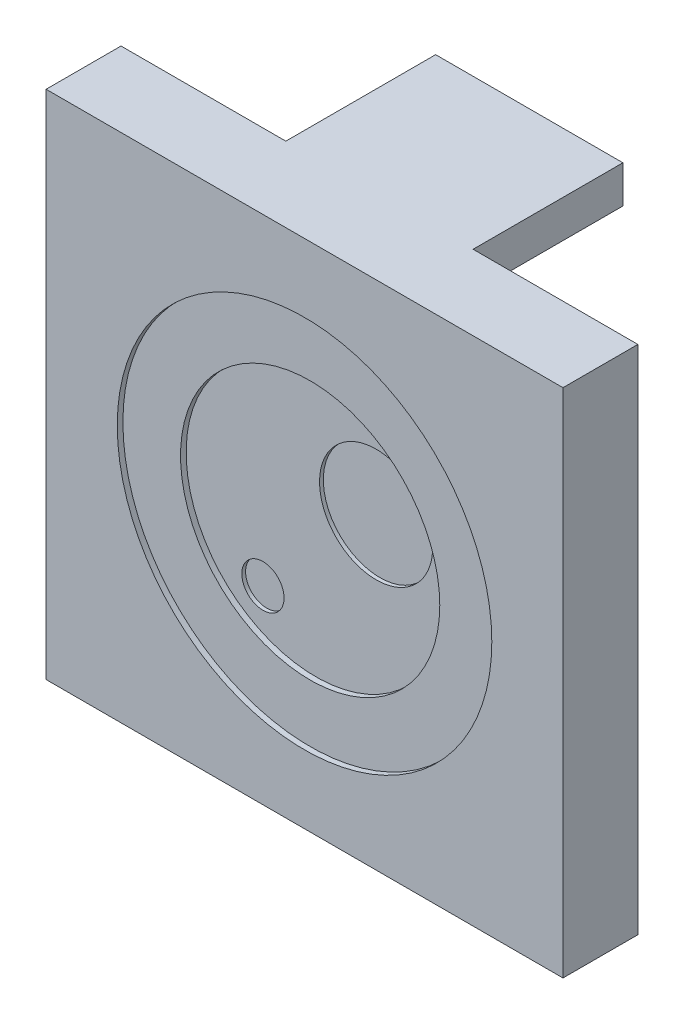
ISO-10303-21;
HEADER;
FILE_DESCRIPTION(('STEP AP214'),'2;1');
FILE_NAME('part.step','',(''),(''),'','','');
FILE_SCHEMA(('AUTOMOTIVE_DESIGN { 1 0 10303 214 1 1 1 1 }'));
ENDSEC;
DATA;
#1=APPLICATION_CONTEXT('core data for automotive mechanical design processes');
#2=APPLICATION_PROTOCOL_DEFINITION('international standard','automotive_design',2000,#1);
#3=PRODUCT_CONTEXT('',#1,'mechanical');
#4=PRODUCT('Part','Part','',(#3));
#5=PRODUCT_RELATED_PRODUCT_CATEGORY('part','',(#4));
#6=PRODUCT_DEFINITION_FORMATION('','',#4);
#7=PRODUCT_DEFINITION_CONTEXT('part definition',#1,'design');
#8=PRODUCT_DEFINITION('design','',#6,#7);
#9=PRODUCT_DEFINITION_SHAPE('','',#8);
#10=(LENGTH_UNIT() NAMED_UNIT(*) SI_UNIT(.MILLI.,.METRE.));
#11=(NAMED_UNIT(*) PLANE_ANGLE_UNIT() SI_UNIT($,.RADIAN.));
#12=(NAMED_UNIT(*) SI_UNIT($,.STERADIAN.) SOLID_ANGLE_UNIT());
#13=UNCERTAINTY_MEASURE_WITH_UNIT(LENGTH_MEASURE(1.E-05),#10,'distance_accuracy_value','');
#14=(GEOMETRIC_REPRESENTATION_CONTEXT(3) GLOBAL_UNCERTAINTY_ASSIGNED_CONTEXT((#13)) GLOBAL_UNIT_ASSIGNED_CONTEXT((#10,
#11,#12)) REPRESENTATION_CONTEXT('',''));
#15=CARTESIAN_POINT('',(0.,0.,0.));
#16=DIRECTION('',(0.,0.,1.));
#17=DIRECTION('',(1.,0.,0.));
#18=AXIS2_PLACEMENT_3D('',#15,#16,#17);
#19=CARTESIAN_POINT('',(13.8,-13.65,4.));
#20=DIRECTION('',(-1.,0.,0.));
#21=DIRECTION('',(0.,0.,1.));
#22=AXIS2_PLACEMENT_3D('',#19,#20,#21);
#23=PLANE('',#22);
#24=DIRECTION('',(0.,1.,0.));
#25=VECTOR('',#24,1.);
#26=CARTESIAN_POINT('',(13.8,-13.65,0.));
#27=LINE('',#26,#25);
#28=CARTESIAN_POINT('',(13.8,-13.65,0.));
#29=VERTEX_POINT('',#28);
#30=CARTESIAN_POINT('',(13.8,13.65,0.));
#31=VERTEX_POINT('',#30);
#32=EDGE_CURVE('E146',#29,#31,#27,.T.);
#33=ORIENTED_EDGE('',*,*,#32,.T.);
#34=DIRECTION('',(0.,0.,-1.));
#35=VECTOR('',#34,1.);
#36=CARTESIAN_POINT('',(13.8,13.65,4.));
#37=LINE('',#36,#35);
#38=CARTESIAN_POINT('',(13.8,13.65,4.));
#39=VERTEX_POINT('',#38);
#40=EDGE_CURVE('E11',#39,#31,#37,.T.);
#41=ORIENTED_EDGE('',*,*,#40,.F.);
#42=DIRECTION('',(0.,1.,0.));
#43=VECTOR('',#42,1.);
#44=CARTESIAN_POINT('',(13.8,-13.65,4.));
#45=LINE('',#44,#43);
#46=CARTESIAN_POINT('',(13.8,-13.65,4.));
#47=VERTEX_POINT('',#46);
#48=EDGE_CURVE('E150',#47,#39,#45,.T.);
#49=ORIENTED_EDGE('',*,*,#48,.F.);
#50=DIRECTION('',(0.,0.,-1.));
#51=VECTOR('',#50,1.);
#52=CARTESIAN_POINT('',(13.8,-13.65,4.));
#53=LINE('',#52,#51);
#54=EDGE_CURVE('E160',#47,#29,#53,.T.);
#55=ORIENTED_EDGE('',*,*,#54,.T.);
#56=EDGE_LOOP('',(#33,#41,#49,#55));
#57=FACE_BOUND('',#56,.T.);
#58=ADVANCED_FACE('F37',(#57),#23,.F.);
#59=CARTESIAN_POINT('',(-13.8,13.65,4.));
#60=DIRECTION('',(0.,-1.,0.));
#61=DIRECTION('',(0.,0.,-1.));
#62=AXIS2_PLACEMENT_3D('',#59,#60,#61);
#63=PLANE('',#62);
#64=DIRECTION('',(-1.,0.,0.));
#65=VECTOR('',#64,1.);
#66=CARTESIAN_POINT('',(-13.8,13.65,0.));
#67=LINE('',#66,#65);
#68=CARTESIAN_POINT('',(4.99999999999999,13.65,0.));
#69=VERTEX_POINT('',#68);
#70=EDGE_CURVE('E163',#31,#69,#67,.T.);
#71=ORIENTED_EDGE('',*,*,#70,.T.);
#72=DIRECTION('',(0.,0.,1.));
#73=VECTOR('',#72,1.);
#74=CARTESIAN_POINT('',(5.,13.65,-8.));
#75=LINE('',#74,#73);
#76=CARTESIAN_POINT('',(5.,13.65,-8.));
#77=VERTEX_POINT('',#76);
#78=EDGE_CURVE('E111',#77,#69,#75,.T.);
#79=ORIENTED_EDGE('',*,*,#78,.F.);
#80=DIRECTION('',(1.,0.,0.));
#81=VECTOR('',#80,1.);
#82=CARTESIAN_POINT('',(5.,13.65,-8.));
#83=LINE('',#82,#81);
#84=CARTESIAN_POINT('',(-5.,13.65,-8.));
#85=VERTEX_POINT('',#84);
#86=EDGE_CURVE('E104',#85,#77,#83,.T.);
#87=ORIENTED_EDGE('',*,*,#86,.F.);
#88=DIRECTION('',(0.,0.,1.));
#89=VECTOR('',#88,1.);
#90=CARTESIAN_POINT('',(-5.,13.65,-8.));
#91=LINE('',#90,#89);
#92=CARTESIAN_POINT('',(-5.00000000000001,13.65,0.));
#93=VERTEX_POINT('',#92);
#94=EDGE_CURVE('E109',#85,#93,#91,.T.);
#95=ORIENTED_EDGE('',*,*,#94,.T.);
#96=CARTESIAN_POINT('',(-13.8,13.65,0.));
#97=VERTEX_POINT('',#96);
#98=EDGE_CURVE('E58',#93,#97,#67,.T.);
#99=ORIENTED_EDGE('',*,*,#98,.T.);
#100=DIRECTION('',(0.,0.,-1.));
#101=VECTOR('',#100,1.);
#102=CARTESIAN_POINT('',(-13.8,13.65,4.));
#103=LINE('',#102,#101);
#104=CARTESIAN_POINT('',(-13.8,13.65,4.));
#105=VERTEX_POINT('',#104);
#106=EDGE_CURVE('E45',#105,#97,#103,.T.);
#107=ORIENTED_EDGE('',*,*,#106,.F.);
#108=DIRECTION('',(-1.,0.,0.));
#109=VECTOR('',#108,1.);
#110=CARTESIAN_POINT('',(-13.8,13.65,4.));
#111=LINE('',#110,#109);
#112=EDGE_CURVE('E153',#39,#105,#111,.T.);
#113=ORIENTED_EDGE('',*,*,#112,.F.);
#114=ORIENTED_EDGE('',*,*,#40,.T.);
#115=EDGE_LOOP('',(#71,#79,#87,#95,#99,#107,#113,#114));
#116=FACE_BOUND('',#115,.T.);
#117=ADVANCED_FACE('F107',(#116),#63,.F.);
#118=CARTESIAN_POINT('',(-13.8,-13.65,4.));
#119=DIRECTION('',(1.,0.,0.));
#120=DIRECTION('',(0.,0.,-1.));
#121=AXIS2_PLACEMENT_3D('',#118,#119,#120);
#122=PLANE('',#121);
#123=DIRECTION('',(0.,-1.,0.));
#124=VECTOR('',#123,1.);
#125=CARTESIAN_POINT('',(-13.8,-13.65,0.));
#126=LINE('',#125,#124);
#127=CARTESIAN_POINT('',(-13.8,-13.65,0.));
#128=VERTEX_POINT('',#127);
#129=EDGE_CURVE('E165',#97,#128,#126,.T.);
#130=ORIENTED_EDGE('',*,*,#129,.T.);
#131=DIRECTION('',(0.,0.,-1.));
#132=VECTOR('',#131,1.);
#133=CARTESIAN_POINT('',(-13.8,-13.65,4.));
#134=LINE('',#133,#132);
#135=CARTESIAN_POINT('',(-13.8,-13.65,4.));
#136=VERTEX_POINT('',#135);
#137=EDGE_CURVE('E170',#136,#128,#134,.T.);
#138=ORIENTED_EDGE('',*,*,#137,.F.);
#139=DIRECTION('',(0.,-1.,0.));
#140=VECTOR('',#139,1.);
#141=CARTESIAN_POINT('',(-13.8,-13.65,4.));
#142=LINE('',#141,#140);
#143=EDGE_CURVE('E156',#105,#136,#142,.T.);
#144=ORIENTED_EDGE('',*,*,#143,.F.);
#145=ORIENTED_EDGE('',*,*,#106,.T.);
#146=EDGE_LOOP('',(#130,#138,#144,#145));
#147=FACE_BOUND('',#146,.T.);
#148=ADVANCED_FACE('F208',(#147),#122,.F.);
#149=CARTESIAN_POINT('',(-13.8,-13.65,4.));
#150=DIRECTION('',(0.,1.,0.));
#151=DIRECTION('',(0.,0.,1.));
#152=AXIS2_PLACEMENT_3D('',#149,#150,#151);
#153=PLANE('',#152);
#154=DIRECTION('',(1.,0.,0.));
#155=VECTOR('',#154,1.);
#156=CARTESIAN_POINT('',(-13.8,-13.65,0.));
#157=LINE('',#156,#155);
#158=EDGE_CURVE('E154',#128,#29,#157,.T.);
#159=ORIENTED_EDGE('',*,*,#158,.T.);
#160=ORIENTED_EDGE('',*,*,#54,.F.);
#161=DIRECTION('',(1.,0.,0.));
#162=VECTOR('',#161,1.);
#163=CARTESIAN_POINT('',(-13.8,-13.65,4.));
#164=LINE('',#163,#162);
#165=EDGE_CURVE('E158',#136,#47,#164,.T.);
#166=ORIENTED_EDGE('',*,*,#165,.F.);
#167=ORIENTED_EDGE('',*,*,#137,.T.);
#168=EDGE_LOOP('',(#159,#160,#166,#167));
#169=FACE_BOUND('',#168,.T.);
#170=ADVANCED_FACE('F224',(#169),#153,.F.);
#171=CARTESIAN_POINT('',(0.,0.,4.));
#172=DIRECTION('',(0.,0.,-1.));
#173=DIRECTION('',(-1.,0.,0.));
#174=AXIS2_PLACEMENT_3D('',#171,#172,#173);
#175=PLANE('',#174);
#176=CARTESIAN_POINT('',(0.,0.,4.));
#177=DIRECTION('',(0.,0.,1.));
#178=DIRECTION('',(1.,0.,0.));
#179=AXIS2_PLACEMENT_3D('',#176,#177,#178);
#180=CIRCLE('',#179,10.);
#181=CARTESIAN_POINT('',(10.,0.,4.));
#182=VERTEX_POINT('',#181);
#183=EDGE_CURVE('E147',#182,#182,#180,.T.);
#184=ORIENTED_EDGE('',*,*,#183,.F.);
#185=EDGE_LOOP('',(#184));
#186=FACE_BOUND('',#185,.T.);
#187=ORIENTED_EDGE('',*,*,#48,.T.);
#188=ORIENTED_EDGE('',*,*,#112,.T.);
#189=ORIENTED_EDGE('',*,*,#143,.T.);
#190=ORIENTED_EDGE('',*,*,#165,.T.);
#191=EDGE_LOOP('',(#187,#188,#189,#190));
#192=FACE_BOUND('',#191,.T.);
#193=ADVANCED_FACE('F220',(#186,#192),#175,.F.);
#194=CARTESIAN_POINT('',(0.,0.,0.));
#195=DIRECTION('',(0.,0.,-1.));
#196=DIRECTION('',(-1.,0.,0.));
#197=AXIS2_PLACEMENT_3D('',#194,#195,#196);
#198=PLANE('',#197);
#199=DIRECTION('',(0.,1.,0.));
#200=VECTOR('',#199,1.);
#201=CARTESIAN_POINT('',(-5.,13.65,0.));
#202=LINE('',#201,#200);
#203=CARTESIAN_POINT('',(-5.,11.65,0.));
#204=VERTEX_POINT('',#203);
#205=EDGE_CURVE('E53',#204,#93,#202,.T.);
#206=ORIENTED_EDGE('',*,*,#205,.F.);
#207=DIRECTION('',(-1.,0.,0.));
#208=VECTOR('',#207,1.);
#209=CARTESIAN_POINT('',(5.,11.65,0.));
#210=LINE('',#209,#208);
#211=CARTESIAN_POINT('',(5.,11.65,0.));
#212=VERTEX_POINT('',#211);
#213=EDGE_CURVE('E124',#212,#204,#210,.T.);
#214=ORIENTED_EDGE('',*,*,#213,.F.);
#215=DIRECTION('',(0.,-1.,0.));
#216=VECTOR('',#215,1.);
#217=CARTESIAN_POINT('',(5.,13.65,0.));
#218=LINE('',#217,#216);
#219=EDGE_CURVE('E216',#69,#212,#218,.T.);
#220=ORIENTED_EDGE('',*,*,#219,.F.);
#221=ORIENTED_EDGE('',*,*,#70,.F.);
#222=ORIENTED_EDGE('',*,*,#32,.F.);
#223=ORIENTED_EDGE('',*,*,#158,.F.);
#224=ORIENTED_EDGE('',*,*,#129,.F.);
#225=ORIENTED_EDGE('',*,*,#98,.F.);
#226=EDGE_LOOP('',(#206,#214,#220,#221,#222,#223,#224,#225));
#227=FACE_BOUND('',#226,.T.);
#228=ADVANCED_FACE('F214',(#227),#198,.T.);
#229=CARTESIAN_POINT('',(0.,0.,3.7));
#230=DIRECTION('',(0.,0.,1.));
#231=DIRECTION('',(1.,0.,0.));
#232=AXIS2_PLACEMENT_3D('',#229,#230,#231);
#233=CYLINDRICAL_SURFACE('',#232,10.);
#234=CARTESIAN_POINT('',(0.,0.,3.7));
#235=DIRECTION('',(0.,0.,1.));
#236=DIRECTION('',(1.,0.,0.));
#237=AXIS2_PLACEMENT_3D('',#234,#235,#236);
#238=CIRCLE('',#237,10.);
#239=CARTESIAN_POINT('',(10.,0.,3.7));
#240=VERTEX_POINT('',#239);
#241=EDGE_CURVE('E143',#240,#240,#238,.T.);
#242=ORIENTED_EDGE('',*,*,#241,.F.);
#243=EDGE_LOOP('',(#242));
#244=FACE_BOUND('',#243,.T.);
#245=ORIENTED_EDGE('',*,*,#183,.T.);
#246=EDGE_LOOP('',(#245));
#247=FACE_BOUND('',#246,.T.);
#248=ADVANCED_FACE('F199',(#244,#247),#233,.F.);
#249=CARTESIAN_POINT('',(0.,0.,3.7));
#250=DIRECTION('',(0.,0.,1.));
#251=DIRECTION('',(1.,0.,0.));
#252=AXIS2_PLACEMENT_3D('',#249,#250,#251);
#253=PLANE('',#252);
#254=CARTESIAN_POINT('',(0.,0.,3.7));
#255=DIRECTION('',(0.,0.,1.));
#256=DIRECTION('',(1.,0.,0.));
#257=AXIS2_PLACEMENT_3D('',#254,#255,#256);
#258=CIRCLE('',#257,6.92166100032446);
#259=CARTESIAN_POINT('',(6.92166100032446,0.,3.7));
#260=VERTEX_POINT('',#259);
#261=EDGE_CURVE('E142',#260,#260,#258,.T.);
#262=ORIENTED_EDGE('',*,*,#261,.F.);
#263=EDGE_LOOP('',(#262));
#264=FACE_BOUND('',#263,.T.);
#265=ORIENTED_EDGE('',*,*,#241,.T.);
#266=EDGE_LOOP('',(#265));
#267=FACE_BOUND('',#266,.T.);
#268=ADVANCED_FACE('F189',(#264,#267),#253,.T.);
#269=CARTESIAN_POINT('',(0.,0.,3.4));
#270=DIRECTION('',(0.,0.,1.));
#271=DIRECTION('',(1.,0.,0.));
#272=AXIS2_PLACEMENT_3D('',#269,#270,#271);
#273=CYLINDRICAL_SURFACE('',#272,6.92166100032446);
#274=ORIENTED_EDGE('',*,*,#261,.T.);
#275=EDGE_LOOP('',(#274));
#276=FACE_BOUND('',#275,.T.);
#277=CARTESIAN_POINT('',(0.,0.,3.4));
#278=DIRECTION('',(0.,0.,1.));
#279=DIRECTION('',(1.,0.,0.));
#280=AXIS2_PLACEMENT_3D('',#277,#278,#279);
#281=CIRCLE('',#280,6.92166100032446);
#282=CARTESIAN_POINT('',(5.71853676061223,3.89970874821944,3.4));
#283=VERTEX_POINT('',#282);
#284=EDGE_CURVE('E139',#283,#283,#281,.T.);
#285=ORIENTED_EDGE('',*,*,#284,.F.);
#286=EDGE_LOOP('',(#285));
#287=FACE_BOUND('',#286,.T.);
#288=ADVANCED_FACE('F187',(#276,#287),#273,.F.);
#289=CARTESIAN_POINT('',(0.,0.,3.4));
#290=DIRECTION('',(0.,0.,1.));
#291=DIRECTION('',(1.,0.,0.));
#292=AXIS2_PLACEMENT_3D('',#289,#290,#291);
#293=PLANE('',#292);
#294=CARTESIAN_POINT('',(-2.82117522216301,-4.12807102238485,3.4));
#295=DIRECTION('',(0.,0.,1.));
#296=DIRECTION('',(1.,0.,0.));
#297=AXIS2_PLACEMENT_3D('',#294,#295,#296);
#298=CIRCLE('',#297,1.12734678840662);
#299=CARTESIAN_POINT('',(-1.69382843375639,-4.12807102238485,3.4));
#300=VERTEX_POINT('',#299);
#301=EDGE_CURVE('E137',#300,#300,#298,.T.);
#302=ORIENTED_EDGE('',*,*,#301,.F.);
#303=EDGE_LOOP('',(#302));
#304=FACE_BOUND('',#303,.T.);
#305=ORIENTED_EDGE('',*,*,#284,.T.);
#306=CARTESIAN_POINT('',(3.22301591790364,2.1979089926063,3.4));
#307=DIRECTION('',(0.,0.,1.));
#308=DIRECTION('',(1.,0.,0.));
#309=AXIS2_PLACEMENT_3D('',#306,#307,#308);
#310=CIRCLE('',#309,3.02055403603345);
#311=EDGE_CURVE('E40',#283,#283,#310,.T.);
#312=ORIENTED_EDGE('',*,*,#311,.F.);
#313=EDGE_LOOP('',(#305,#312));
#314=FACE_BOUND('',#313,.T.);
#315=ADVANCED_FACE('F184',(#304,#314),#293,.T.);
#316=CARTESIAN_POINT('',(-2.82117522216301,-4.12807102238485,3.2));
#317=DIRECTION('',(0.,0.,1.));
#318=DIRECTION('',(1.,0.,0.));
#319=AXIS2_PLACEMENT_3D('',#316,#317,#318);
#320=CYLINDRICAL_SURFACE('',#319,1.12734678840662);
#321=ORIENTED_EDGE('',*,*,#301,.T.);
#322=EDGE_LOOP('',(#321));
#323=FACE_BOUND('',#322,.T.);
#324=CARTESIAN_POINT('',(-2.82117522216301,-4.12807102238485,3.2));
#325=DIRECTION('',(0.,0.,1.));
#326=DIRECTION('',(1.,0.,0.));
#327=AXIS2_PLACEMENT_3D('',#324,#325,#326);
#328=CIRCLE('',#327,1.12734678840662);
#329=CARTESIAN_POINT('',(-1.69382843375639,-4.12807102238485,3.2));
#330=VERTEX_POINT('',#329);
#331=EDGE_CURVE('E127',#330,#330,#328,.T.);
#332=ORIENTED_EDGE('',*,*,#331,.F.);
#333=EDGE_LOOP('',(#332));
#334=FACE_BOUND('',#333,.T.);
#335=ADVANCED_FACE('F196',(#323,#334),#320,.F.);
#336=CARTESIAN_POINT('',(-2.82117522216301,-4.12807102238485,3.2));
#337=DIRECTION('',(0.,0.,1.));
#338=DIRECTION('',(1.,0.,0.));
#339=AXIS2_PLACEMENT_3D('',#336,#337,#338);
#340=PLANE('',#339);
#341=ORIENTED_EDGE('',*,*,#331,.T.);
#342=EDGE_LOOP('',(#341));
#343=FACE_BOUND('',#342,.T.);
#344=ADVANCED_FACE('F275',(#343),#340,.T.);
#345=CARTESIAN_POINT('',(3.22301591790364,2.1979089926063,3.2));
#346=DIRECTION('',(0.,0.,1.));
#347=DIRECTION('',(1.,0.,0.));
#348=AXIS2_PLACEMENT_3D('',#345,#346,#347);
#349=CYLINDRICAL_SURFACE('',#348,3.02055403603345);
#350=ORIENTED_EDGE('',*,*,#311,.T.);
#351=EDGE_LOOP('',(#350));
#352=FACE_BOUND('',#351,.T.);
#353=CARTESIAN_POINT('',(3.22301591790364,2.1979089926063,3.2));
#354=DIRECTION('',(0.,0.,1.));
#355=DIRECTION('',(1.,0.,0.));
#356=AXIS2_PLACEMENT_3D('',#353,#354,#355);
#357=CIRCLE('',#356,3.02055403603345);
#358=CARTESIAN_POINT('',(6.24356995393708,2.1979089926063,3.2));
#359=VERTEX_POINT('',#358);
#360=EDGE_CURVE('E130',#359,#359,#357,.T.);
#361=ORIENTED_EDGE('',*,*,#360,.F.);
#362=EDGE_LOOP('',(#361));
#363=FACE_BOUND('',#362,.T.);
#364=ADVANCED_FACE('F181',(#352,#363),#349,.F.);
#365=CARTESIAN_POINT('',(3.22301591790364,2.1979089926063,3.2));
#366=DIRECTION('',(0.,0.,1.));
#367=DIRECTION('',(1.,0.,0.));
#368=AXIS2_PLACEMENT_3D('',#365,#366,#367);
#369=PLANE('',#368);
#370=ORIENTED_EDGE('',*,*,#360,.T.);
#371=EDGE_LOOP('',(#370));
#372=FACE_BOUND('',#371,.T.);
#373=ADVANCED_FACE('F293',(#372),#369,.T.);
#374=CARTESIAN_POINT('',(-5.,13.65,-8.));
#375=DIRECTION('',(1.,0.,0.));
#376=DIRECTION('',(0.,0.,-1.));
#377=AXIS2_PLACEMENT_3D('',#374,#375,#376);
#378=PLANE('',#377);
#379=ORIENTED_EDGE('',*,*,#205,.T.);
#380=ORIENTED_EDGE('',*,*,#94,.F.);
#381=DIRECTION('',(0.,1.,0.));
#382=VECTOR('',#381,1.);
#383=CARTESIAN_POINT('',(-5.,13.65,-8.));
#384=LINE('',#383,#382);
#385=CARTESIAN_POINT('',(-5.,11.65,-8.));
#386=VERTEX_POINT('',#385);
#387=EDGE_CURVE('E115',#386,#85,#384,.T.);
#388=ORIENTED_EDGE('',*,*,#387,.F.);
#389=DIRECTION('',(0.,0.,1.));
#390=VECTOR('',#389,1.);
#391=CARTESIAN_POINT('',(-5.,11.65,-8.));
#392=LINE('',#391,#390);
#393=EDGE_CURVE('E351',#386,#204,#392,.T.);
#394=ORIENTED_EDGE('',*,*,#393,.T.);
#395=EDGE_LOOP('',(#379,#380,#388,#394));
#396=FACE_BOUND('',#395,.T.);
#397=ADVANCED_FACE('F126',(#396),#378,.F.);
#398=CARTESIAN_POINT('',(5.,13.65,-8.));
#399=DIRECTION('',(-1.,0.,0.));
#400=DIRECTION('',(0.,-1.,0.));
#401=AXIS2_PLACEMENT_3D('',#398,#399,#400);
#402=PLANE('',#401);
#403=ORIENTED_EDGE('',*,*,#219,.T.);
#404=DIRECTION('',(0.,0.,1.));
#405=VECTOR('',#404,1.);
#406=CARTESIAN_POINT('',(5.,11.65,-8.));
#407=LINE('',#406,#405);
#408=CARTESIAN_POINT('',(5.,11.65,-8.));
#409=VERTEX_POINT('',#408);
#410=EDGE_CURVE('E132',#409,#212,#407,.T.);
#411=ORIENTED_EDGE('',*,*,#410,.F.);
#412=DIRECTION('',(0.,-1.,0.));
#413=VECTOR('',#412,1.);
#414=CARTESIAN_POINT('',(5.,13.65,-8.));
#415=LINE('',#414,#413);
#416=EDGE_CURVE('E114',#77,#409,#415,.T.);
#417=ORIENTED_EDGE('',*,*,#416,.F.);
#418=ORIENTED_EDGE('',*,*,#78,.T.);
#419=EDGE_LOOP('',(#403,#411,#417,#418));
#420=FACE_BOUND('',#419,.T.);
#421=ADVANCED_FACE('F319',(#420),#402,.F.);
#422=CARTESIAN_POINT('',(5.,11.65,-8.));
#423=DIRECTION('',(0.,1.,0.));
#424=DIRECTION('',(0.,0.,1.));
#425=AXIS2_PLACEMENT_3D('',#422,#423,#424);
#426=PLANE('',#425);
#427=ORIENTED_EDGE('',*,*,#213,.T.);
#428=ORIENTED_EDGE('',*,*,#393,.F.);
#429=DIRECTION('',(-1.,0.,0.));
#430=VECTOR('',#429,1.);
#431=CARTESIAN_POINT('',(5.,11.65,-8.));
#432=LINE('',#431,#430);
#433=EDGE_CURVE('E120',#409,#386,#432,.T.);
#434=ORIENTED_EDGE('',*,*,#433,.F.);
#435=ORIENTED_EDGE('',*,*,#410,.T.);
#436=EDGE_LOOP('',(#427,#428,#434,#435));
#437=FACE_BOUND('',#436,.T.);
#438=ADVANCED_FACE('F328',(#437),#426,.F.);
#439=CARTESIAN_POINT('',(0.,0.,-8.));
#440=DIRECTION('',(0.,0.,-1.));
#441=DIRECTION('',(-1.,0.,0.));
#442=AXIS2_PLACEMENT_3D('',#439,#440,#441);
#443=PLANE('',#442);
#444=ORIENTED_EDGE('',*,*,#387,.T.);
#445=ORIENTED_EDGE('',*,*,#86,.T.);
#446=ORIENTED_EDGE('',*,*,#416,.T.);
#447=ORIENTED_EDGE('',*,*,#433,.T.);
#448=EDGE_LOOP('',(#444,#445,#446,#447));
#449=FACE_BOUND('',#448,.T.);
#450=ADVANCED_FACE('F118',(#449),#443,.T.);
#451=CLOSED_SHELL('',(#58,#117,#148,#170,#193,#228,#248,#268,#288,#315,#335,#344,#364,#373,#397,
#421,#438,#450));
#452=MANIFOLD_SOLID_BREP('B2',#451);
#453=ADVANCED_BREP_SHAPE_REPRESENTATION('',(#18,#452),#14);
#454=SHAPE_DEFINITION_REPRESENTATION(#9,#453);
ENDSEC;
END-ISO-10303-21;
